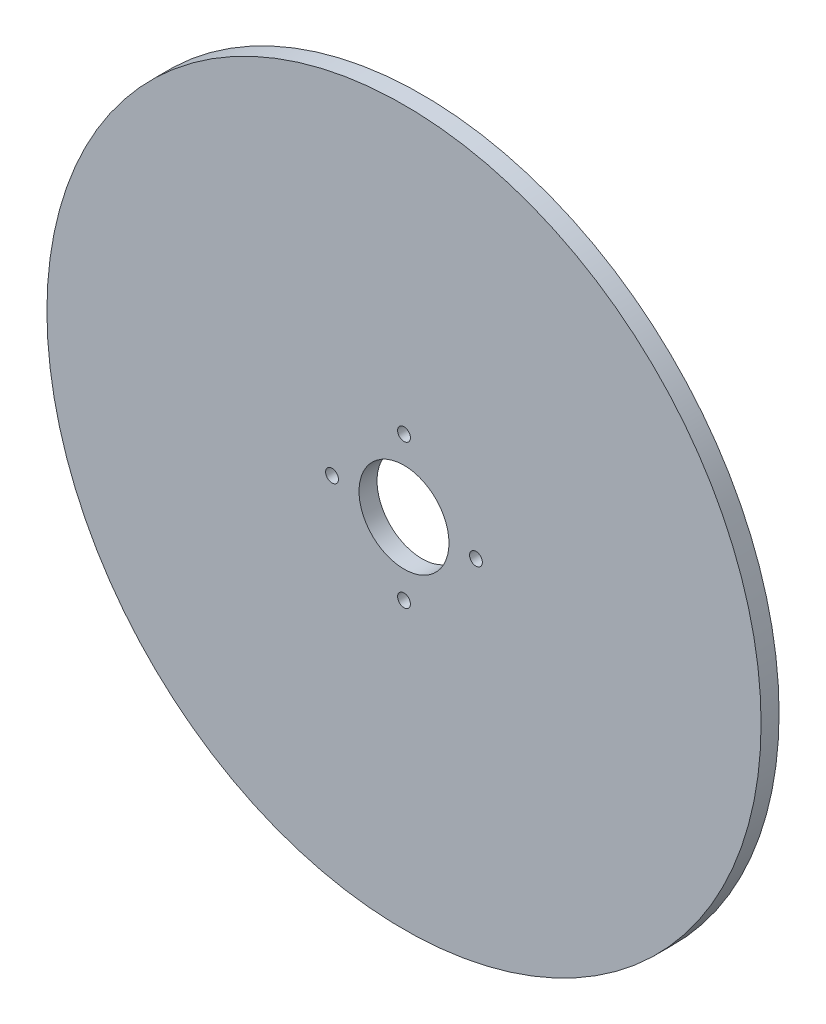
ISO-10303-21;
HEADER;
FILE_DESCRIPTION(('STEP AP214'),'2;1');
FILE_NAME('part.step','',(''),(''),'','','');
FILE_SCHEMA(('AUTOMOTIVE_DESIGN { 1 0 10303 214 1 1 1 1 }'));
ENDSEC;
DATA;
#1=APPLICATION_CONTEXT('core data for automotive mechanical design processes');
#2=APPLICATION_PROTOCOL_DEFINITION('international standard','automotive_design',2000,#1);
#3=PRODUCT_CONTEXT('',#1,'mechanical');
#4=PRODUCT('Part','Part','',(#3));
#5=PRODUCT_RELATED_PRODUCT_CATEGORY('part','',(#4));
#6=PRODUCT_DEFINITION_FORMATION('','',#4);
#7=PRODUCT_DEFINITION_CONTEXT('part definition',#1,'design');
#8=PRODUCT_DEFINITION('design','',#6,#7);
#9=PRODUCT_DEFINITION_SHAPE('','',#8);
#10=(LENGTH_UNIT() NAMED_UNIT(*) SI_UNIT(.MILLI.,.METRE.));
#11=(NAMED_UNIT(*) PLANE_ANGLE_UNIT() SI_UNIT($,.RADIAN.));
#12=(NAMED_UNIT(*) SI_UNIT($,.STERADIAN.) SOLID_ANGLE_UNIT());
#13=UNCERTAINTY_MEASURE_WITH_UNIT(LENGTH_MEASURE(1.E-05),#10,'distance_accuracy_value','');
#14=(GEOMETRIC_REPRESENTATION_CONTEXT(3) GLOBAL_UNCERTAINTY_ASSIGNED_CONTEXT((#13)) GLOBAL_UNIT_ASSIGNED_CONTEXT((#10,
#11,#12)) REPRESENTATION_CONTEXT('',''));
#15=CARTESIAN_POINT('',(0.,0.,0.));
#16=DIRECTION('',(0.,0.,1.));
#17=DIRECTION('',(1.,0.,0.));
#18=AXIS2_PLACEMENT_3D('',#15,#16,#17);
#19=CARTESIAN_POINT('',(0.,0.,3.175));
#20=DIRECTION('',(0.,0.,1.));
#21=DIRECTION('',(1.,0.,0.));
#22=AXIS2_PLACEMENT_3D('',#19,#20,#21);
#23=PLANE('',#22);
#24=CARTESIAN_POINT('',(0.,12.7,3.175));
#25=DIRECTION('',(0.,0.,1.));
#26=DIRECTION('',(1.,0.,0.));
#27=AXIS2_PLACEMENT_3D('',#24,#25,#26);
#28=CIRCLE('',#27,1.1303);
#29=CARTESIAN_POINT('',(1.1303,12.7,3.175));
#30=VERTEX_POINT('',#29);
#31=EDGE_CURVE('E71',#30,#30,#28,.T.);
#32=ORIENTED_EDGE('',*,*,#31,.F.);
#33=EDGE_LOOP('',(#32));
#34=FACE_BOUND('',#33,.T.);
#35=CARTESIAN_POINT('',(0.,-12.7,3.175));
#36=DIRECTION('',(0.,0.,1.));
#37=DIRECTION('',(1.,0.,0.));
#38=AXIS2_PLACEMENT_3D('',#35,#36,#37);
#39=CIRCLE('',#38,1.1303);
#40=CARTESIAN_POINT('',(1.1303,-12.7,3.175));
#41=VERTEX_POINT('',#40);
#42=EDGE_CURVE('E65',#41,#41,#39,.T.);
#43=ORIENTED_EDGE('',*,*,#42,.F.);
#44=EDGE_LOOP('',(#43));
#45=FACE_BOUND('',#44,.T.);
#46=CARTESIAN_POINT('',(12.7,0.,3.175));
#47=DIRECTION('',(0.,0.,1.));
#48=DIRECTION('',(1.,0.,0.));
#49=AXIS2_PLACEMENT_3D('',#46,#47,#48);
#50=CIRCLE('',#49,1.1303);
#51=CARTESIAN_POINT('',(13.8303,0.,3.175));
#52=VERTEX_POINT('',#51);
#53=EDGE_CURVE('E62',#52,#52,#50,.T.);
#54=ORIENTED_EDGE('',*,*,#53,.F.);
#55=EDGE_LOOP('',(#54));
#56=FACE_BOUND('',#55,.T.);
#57=CARTESIAN_POINT('',(-12.7,0.,3.175));
#58=DIRECTION('',(0.,0.,1.));
#59=DIRECTION('',(1.,0.,0.));
#60=AXIS2_PLACEMENT_3D('',#57,#58,#59);
#61=CIRCLE('',#60,1.1303);
#62=CARTESIAN_POINT('',(-11.5697,0.,3.175));
#63=VERTEX_POINT('',#62);
#64=EDGE_CURVE('E56',#63,#63,#61,.T.);
#65=ORIENTED_EDGE('',*,*,#64,.F.);
#66=EDGE_LOOP('',(#65));
#67=FACE_BOUND('',#66,.T.);
#68=CARTESIAN_POINT('',(0.,0.,3.175));
#69=DIRECTION('',(0.,0.,1.));
#70=DIRECTION('',(1.,0.,0.));
#71=AXIS2_PLACEMENT_3D('',#68,#69,#70);
#72=CIRCLE('',#71,63.0174);
#73=CARTESIAN_POINT('',(63.0174,0.,3.175));
#74=VERTEX_POINT('',#73);
#75=EDGE_CURVE('E10',#74,#74,#72,.T.);
#76=ORIENTED_EDGE('',*,*,#75,.T.);
#77=EDGE_LOOP('',(#76));
#78=FACE_BOUND('',#77,.T.);
#79=CARTESIAN_POINT('',(0.,0.,3.175));
#80=DIRECTION('',(0.,0.,1.));
#81=DIRECTION('',(1.,0.,0.));
#82=AXIS2_PLACEMENT_3D('',#79,#80,#81);
#83=CIRCLE('',#82,7.9375);
#84=CARTESIAN_POINT('',(7.9375,0.,3.175));
#85=VERTEX_POINT('',#84);
#86=EDGE_CURVE('E46',#85,#85,#83,.T.);
#87=ORIENTED_EDGE('',*,*,#86,.F.);
#88=EDGE_LOOP('',(#87));
#89=FACE_BOUND('',#88,.T.);
#90=ADVANCED_FACE('F33',(#34,#45,#56,#67,#78,#89),#23,.T.);
#91=CARTESIAN_POINT('',(0.,0.,0.));
#92=DIRECTION('',(0.,0.,1.));
#93=DIRECTION('',(1.,0.,0.));
#94=AXIS2_PLACEMENT_3D('',#91,#92,#93);
#95=PLANE('',#94);
#96=CARTESIAN_POINT('',(0.,12.7,0.));
#97=DIRECTION('',(0.,0.,1.));
#98=DIRECTION('',(1.,0.,0.));
#99=AXIS2_PLACEMENT_3D('',#96,#97,#98);
#100=CIRCLE('',#99,1.1303);
#101=CARTESIAN_POINT('',(1.1303,12.7,0.));
#102=VERTEX_POINT('',#101);
#103=EDGE_CURVE('E68',#102,#102,#100,.T.);
#104=ORIENTED_EDGE('',*,*,#103,.T.);
#105=EDGE_LOOP('',(#104));
#106=FACE_BOUND('',#105,.T.);
#107=CARTESIAN_POINT('',(0.,-12.7,0.));
#108=DIRECTION('',(0.,0.,1.));
#109=DIRECTION('',(1.,0.,0.));
#110=AXIS2_PLACEMENT_3D('',#107,#108,#109);
#111=CIRCLE('',#110,1.1303);
#112=CARTESIAN_POINT('',(1.1303,-12.7,0.));
#113=VERTEX_POINT('',#112);
#114=EDGE_CURVE('E37',#113,#113,#111,.T.);
#115=ORIENTED_EDGE('',*,*,#114,.T.);
#116=EDGE_LOOP('',(#115));
#117=FACE_BOUND('',#116,.T.);
#118=CARTESIAN_POINT('',(12.7,0.,0.));
#119=DIRECTION('',(0.,0.,1.));
#120=DIRECTION('',(1.,0.,0.));
#121=AXIS2_PLACEMENT_3D('',#118,#119,#120);
#122=CIRCLE('',#121,1.1303);
#123=CARTESIAN_POINT('',(13.8303,0.,0.));
#124=VERTEX_POINT('',#123);
#125=EDGE_CURVE('E59',#124,#124,#122,.T.);
#126=ORIENTED_EDGE('',*,*,#125,.T.);
#127=EDGE_LOOP('',(#126));
#128=FACE_BOUND('',#127,.T.);
#129=CARTESIAN_POINT('',(-12.7,0.,0.));
#130=DIRECTION('',(0.,0.,1.));
#131=DIRECTION('',(1.,0.,0.));
#132=AXIS2_PLACEMENT_3D('',#129,#130,#131);
#133=CIRCLE('',#132,1.1303);
#134=CARTESIAN_POINT('',(-11.5697,0.,0.));
#135=VERTEX_POINT('',#134);
#136=EDGE_CURVE('E51',#135,#135,#133,.T.);
#137=ORIENTED_EDGE('',*,*,#136,.T.);
#138=EDGE_LOOP('',(#137));
#139=FACE_BOUND('',#138,.T.);
#140=CARTESIAN_POINT('',(0.,0.,0.));
#141=DIRECTION('',(0.,0.,1.));
#142=DIRECTION('',(1.,0.,0.));
#143=AXIS2_PLACEMENT_3D('',#140,#141,#142);
#144=CIRCLE('',#143,63.0174);
#145=CARTESIAN_POINT('',(63.0174,0.,0.));
#146=VERTEX_POINT('',#145);
#147=EDGE_CURVE('E41',#146,#146,#144,.T.);
#148=ORIENTED_EDGE('',*,*,#147,.F.);
#149=EDGE_LOOP('',(#148));
#150=FACE_BOUND('',#149,.T.);
#151=CARTESIAN_POINT('',(0.,0.,0.));
#152=DIRECTION('',(0.,0.,1.));
#153=DIRECTION('',(1.,0.,0.));
#154=AXIS2_PLACEMENT_3D('',#151,#152,#153);
#155=CIRCLE('',#154,7.9375);
#156=CARTESIAN_POINT('',(7.9375,0.,0.));
#157=VERTEX_POINT('',#156);
#158=EDGE_CURVE('E48',#157,#157,#155,.T.);
#159=ORIENTED_EDGE('',*,*,#158,.T.);
#160=EDGE_LOOP('',(#159));
#161=FACE_BOUND('',#160,.T.);
#162=ADVANCED_FACE('F80',(#106,#117,#128,#139,#150,#161),#95,.F.);
#163=CARTESIAN_POINT('',(0.,0.,3.175));
#164=DIRECTION('',(0.,0.,-1.));
#165=DIRECTION('',(-1.,0.,0.));
#166=AXIS2_PLACEMENT_3D('',#163,#164,#165);
#167=CYLINDRICAL_SURFACE('',#166,63.0174);
#168=ORIENTED_EDGE('',*,*,#75,.F.);
#169=EDGE_LOOP('',(#168));
#170=FACE_BOUND('',#169,.T.);
#171=ORIENTED_EDGE('',*,*,#147,.T.);
#172=EDGE_LOOP('',(#171));
#173=FACE_BOUND('',#172,.T.);
#174=ADVANCED_FACE('F35',(#170,#173),#167,.T.);
#175=CARTESIAN_POINT('',(0.,0.,3.175));
#176=DIRECTION('',(0.,0.,-1.));
#177=DIRECTION('',(-1.,0.,0.));
#178=AXIS2_PLACEMENT_3D('',#175,#176,#177);
#179=CYLINDRICAL_SURFACE('',#178,7.9375);
#180=ORIENTED_EDGE('',*,*,#86,.T.);
#181=EDGE_LOOP('',(#180));
#182=FACE_BOUND('',#181,.T.);
#183=ORIENTED_EDGE('',*,*,#158,.F.);
#184=EDGE_LOOP('',(#183));
#185=FACE_BOUND('',#184,.T.);
#186=ADVANCED_FACE('F90',(#182,#185),#179,.F.);
#187=CARTESIAN_POINT('',(-12.7,0.,3.175));
#188=DIRECTION('',(0.,0.,1.));
#189=DIRECTION('',(1.,0.,0.));
#190=AXIS2_PLACEMENT_3D('',#187,#188,#189);
#191=CYLINDRICAL_SURFACE('',#190,1.1303);
#192=ORIENTED_EDGE('',*,*,#64,.T.);
#193=EDGE_LOOP('',(#192));
#194=FACE_BOUND('',#193,.T.);
#195=ORIENTED_EDGE('',*,*,#136,.F.);
#196=EDGE_LOOP('',(#195));
#197=FACE_BOUND('',#196,.T.);
#198=ADVANCED_FACE('F93',(#194,#197),#191,.F.);
#199=CARTESIAN_POINT('',(12.7,0.,3.175));
#200=DIRECTION('',(0.,0.,1.));
#201=DIRECTION('',(1.,0.,0.));
#202=AXIS2_PLACEMENT_3D('',#199,#200,#201);
#203=CYLINDRICAL_SURFACE('',#202,1.1303);
#204=ORIENTED_EDGE('',*,*,#53,.T.);
#205=EDGE_LOOP('',(#204));
#206=FACE_BOUND('',#205,.T.);
#207=ORIENTED_EDGE('',*,*,#125,.F.);
#208=EDGE_LOOP('',(#207));
#209=FACE_BOUND('',#208,.T.);
#210=ADVANCED_FACE('F107',(#206,#209),#203,.F.);
#211=CARTESIAN_POINT('',(0.,-12.7,3.175));
#212=DIRECTION('',(0.,0.,1.));
#213=DIRECTION('',(1.,0.,0.));
#214=AXIS2_PLACEMENT_3D('',#211,#212,#213);
#215=CYLINDRICAL_SURFACE('',#214,1.1303);
#216=ORIENTED_EDGE('',*,*,#42,.T.);
#217=EDGE_LOOP('',(#216));
#218=FACE_BOUND('',#217,.T.);
#219=ORIENTED_EDGE('',*,*,#114,.F.);
#220=EDGE_LOOP('',(#219));
#221=FACE_BOUND('',#220,.T.);
#222=ADVANCED_FACE('F111',(#218,#221),#215,.F.);
#223=CARTESIAN_POINT('',(0.,12.7,3.175));
#224=DIRECTION('',(0.,0.,1.));
#225=DIRECTION('',(1.,0.,0.));
#226=AXIS2_PLACEMENT_3D('',#223,#224,#225);
#227=CYLINDRICAL_SURFACE('',#226,1.1303);
#228=ORIENTED_EDGE('',*,*,#31,.T.);
#229=EDGE_LOOP('',(#228));
#230=FACE_BOUND('',#229,.T.);
#231=ORIENTED_EDGE('',*,*,#103,.F.);
#232=EDGE_LOOP('',(#231));
#233=FACE_BOUND('',#232,.T.);
#234=ADVANCED_FACE('F75',(#230,#233),#227,.F.);
#235=CLOSED_SHELL('',(#90,#162,#174,#186,#198,#210,#222,#234));
#236=MANIFOLD_SOLID_BREP('B2',#235);
#237=ADVANCED_BREP_SHAPE_REPRESENTATION('',(#18,#236),#14);
#238=SHAPE_DEFINITION_REPRESENTATION(#9,#237);
ENDSEC;
END-ISO-10303-21;
